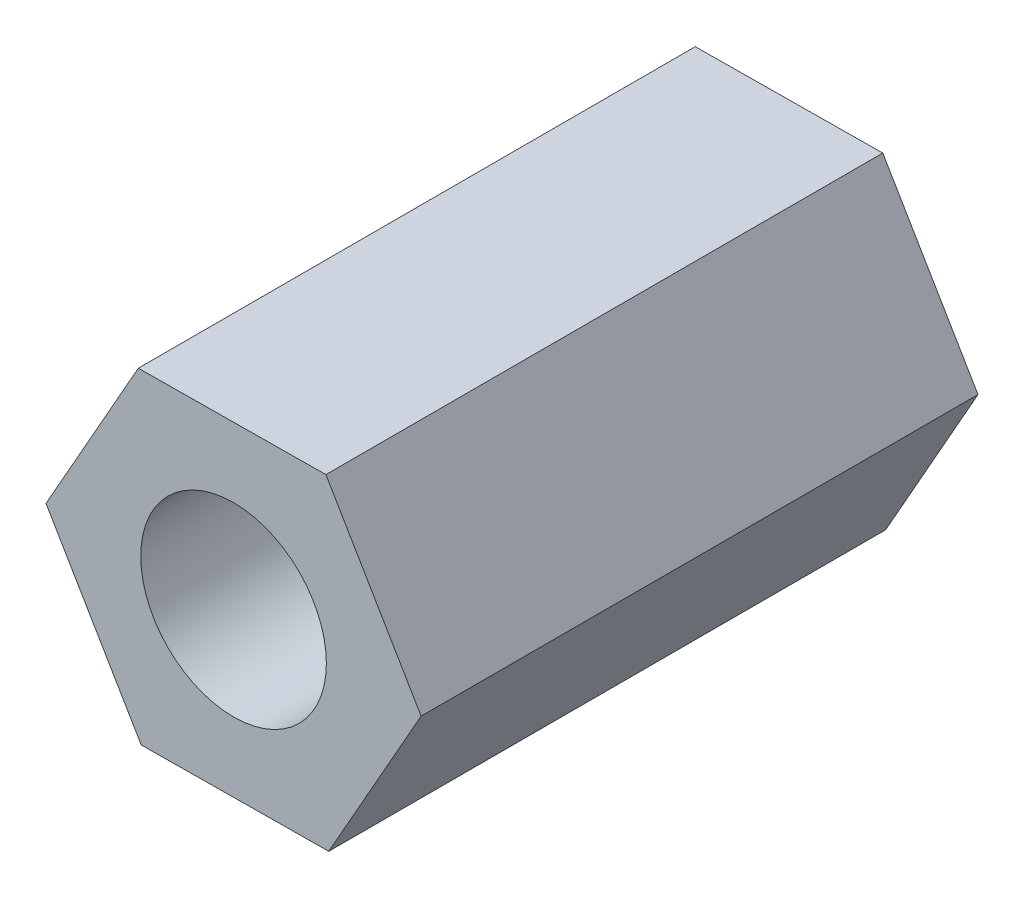
ISO-10303-21;
HEADER;
FILE_DESCRIPTION(('STEP AP214'),'2;1');
FILE_NAME('part.step','',(''),(''),'','','');
FILE_SCHEMA(('AUTOMOTIVE_DESIGN { 1 0 10303 214 1 1 1 1 }'));
ENDSEC;
DATA;
#1=APPLICATION_CONTEXT('core data for automotive mechanical design processes');
#2=APPLICATION_PROTOCOL_DEFINITION('international standard','automotive_design',2000,#1);
#3=PRODUCT_CONTEXT('',#1,'mechanical');
#4=PRODUCT('Part','Part','',(#3));
#5=PRODUCT_RELATED_PRODUCT_CATEGORY('part','',(#4));
#6=PRODUCT_DEFINITION_FORMATION('','',#4);
#7=PRODUCT_DEFINITION_CONTEXT('part definition',#1,'design');
#8=PRODUCT_DEFINITION('design','',#6,#7);
#9=PRODUCT_DEFINITION_SHAPE('','',#8);
#10=(LENGTH_UNIT() NAMED_UNIT(*) SI_UNIT(.MILLI.,.METRE.));
#11=(NAMED_UNIT(*) PLANE_ANGLE_UNIT() SI_UNIT($,.RADIAN.));
#12=(NAMED_UNIT(*) SI_UNIT($,.STERADIAN.) SOLID_ANGLE_UNIT());
#13=UNCERTAINTY_MEASURE_WITH_UNIT(LENGTH_MEASURE(1.E-05),#10,'distance_accuracy_value','');
#14=(GEOMETRIC_REPRESENTATION_CONTEXT(3) GLOBAL_UNCERTAINTY_ASSIGNED_CONTEXT((#13)) GLOBAL_UNIT_ASSIGNED_CONTEXT((#10,
#11,#12)) REPRESENTATION_CONTEXT('',''));
#15=CARTESIAN_POINT('',(0.,0.,0.));
#16=DIRECTION('',(0.,0.,1.));
#17=DIRECTION('',(1.,0.,0.));
#18=AXIS2_PLACEMENT_3D('',#15,#16,#17);
#19=CARTESIAN_POINT('',(0.,0.,12.));
#20=DIRECTION('',(0.,0.,1.));
#21=DIRECTION('',(1.,0.,0.));
#22=AXIS2_PLACEMENT_3D('',#19,#20,#21);
#23=PLANE('',#22);
#24=DIRECTION('',(0.999961257640527,0.00880245522430722,0.));
#25=VECTOR('',#24,1.);
#26=CARTESIAN_POINT('',(-1.98983906118775,-3.51765175136834,12.));
#27=LINE('',#26,#25);
#28=CARTESIAN_POINT('',(-1.98983906118775,-3.51765175136834,12.));
#29=VERTEX_POINT('',#28);
#30=CARTESIAN_POINT('',(2.05145624775792,-3.48207705211536,12.));
#31=VERTEX_POINT('',#30);
#32=EDGE_CURVE('E133',#29,#31,#27,.T.);
#33=ORIENTED_EDGE('',*,*,#32,.T.);
#34=DIRECTION('',(0.492357478980338,0.870393079529086,0.));
#35=VECTOR('',#34,1.);
#36=CARTESIAN_POINT('',(2.05145624775792,-3.48207705211536,12.));
#37=LINE('',#36,#35);
#38=CARTESIAN_POINT('',(4.04129530894568,0.0355746992529791,12.));
#39=VERTEX_POINT('',#38);
#40=EDGE_CURVE('E91',#31,#39,#37,.T.);
#41=ORIENTED_EDGE('',*,*,#40,.T.);
#42=DIRECTION('',(-0.507603778660189,0.861590624304779,0.));
#43=VECTOR('',#42,1.);
#44=CARTESIAN_POINT('',(4.04129530894568,0.0355746992529791,12.));
#45=LINE('',#44,#43);
#46=CARTESIAN_POINT('',(1.98983906118776,3.51765175136834,12.));
#47=VERTEX_POINT('',#46);
#48=EDGE_CURVE('E104',#39,#47,#45,.T.);
#49=ORIENTED_EDGE('',*,*,#48,.T.);
#50=DIRECTION('',(-0.999961257640527,-0.00880245522430723,0.));
#51=VECTOR('',#50,1.);
#52=CARTESIAN_POINT('',(1.98983906118776,3.51765175136834,12.));
#53=LINE('',#52,#51);
#54=CARTESIAN_POINT('',(-2.05145624775791,3.48207705211536,12.));
#55=VERTEX_POINT('',#54);
#56=EDGE_CURVE('E98',#47,#55,#53,.T.);
#57=ORIENTED_EDGE('',*,*,#56,.T.);
#58=DIRECTION('',(-0.492357478980338,-0.870393079529086,0.));
#59=VECTOR('',#58,1.);
#60=CARTESIAN_POINT('',(-2.05145624775791,3.48207705211536,12.));
#61=LINE('',#60,#59);
#62=CARTESIAN_POINT('',(-4.04129530894568,-0.0355746992529825,12.));
#63=VERTEX_POINT('',#62);
#64=EDGE_CURVE('E102',#55,#63,#61,.T.);
#65=ORIENTED_EDGE('',*,*,#64,.T.);
#66=DIRECTION('',(0.507603778660189,-0.861590624304779,0.));
#67=VECTOR('',#66,1.);
#68=CARTESIAN_POINT('',(-4.04129530894568,-0.0355746992529825,12.));
#69=LINE('',#68,#67);
#70=EDGE_CURVE('E54',#63,#29,#69,.T.);
#71=ORIENTED_EDGE('',*,*,#70,.T.);
#72=EDGE_LOOP('',(#33,#41,#49,#57,#65,#71));
#73=FACE_BOUND('',#72,.T.);
#74=CARTESIAN_POINT('',(0.,0.,12.));
#75=DIRECTION('',(0.,0.,1.));
#76=DIRECTION('',(1.,0.,0.));
#77=AXIS2_PLACEMENT_3D('',#74,#75,#76);
#78=CIRCLE('',#77,2.);
#79=CARTESIAN_POINT('',(2.,0.,12.));
#80=VERTEX_POINT('',#79);
#81=EDGE_CURVE('E126',#80,#80,#78,.T.);
#82=ORIENTED_EDGE('',*,*,#81,.F.);
#83=EDGE_LOOP('',(#82));
#84=FACE_BOUND('',#83,.T.);
#85=ADVANCED_FACE('F37',(#73,#84),#23,.T.);
#86=CARTESIAN_POINT('',(0.,0.,0.));
#87=DIRECTION('',(0.,0.,1.));
#88=DIRECTION('',(1.,0.,0.));
#89=AXIS2_PLACEMENT_3D('',#86,#87,#88);
#90=PLANE('',#89);
#91=DIRECTION('',(0.999961257640527,0.00880245522430722,0.));
#92=VECTOR('',#91,1.);
#93=CARTESIAN_POINT('',(-1.98983906118775,-3.51765175136834,0.));
#94=LINE('',#93,#92);
#95=CARTESIAN_POINT('',(-1.98983906118775,-3.51765175136834,0.));
#96=VERTEX_POINT('',#95);
#97=CARTESIAN_POINT('',(2.05145624775792,-3.48207705211536,0.));
#98=VERTEX_POINT('',#97);
#99=EDGE_CURVE('E122',#96,#98,#94,.T.);
#100=ORIENTED_EDGE('',*,*,#99,.F.);
#101=DIRECTION('',(0.507603778660189,-0.861590624304779,0.));
#102=VECTOR('',#101,1.);
#103=CARTESIAN_POINT('',(-4.04129530894568,-0.0355746992529825,0.));
#104=LINE('',#103,#102);
#105=CARTESIAN_POINT('',(-4.04129530894568,-0.0355746992529825,0.));
#106=VERTEX_POINT('',#105);
#107=EDGE_CURVE('E83',#106,#96,#104,.T.);
#108=ORIENTED_EDGE('',*,*,#107,.F.);
#109=DIRECTION('',(-0.492357478980338,-0.870393079529086,0.));
#110=VECTOR('',#109,1.);
#111=CARTESIAN_POINT('',(-2.05145624775791,3.48207705211536,0.));
#112=LINE('',#111,#110);
#113=CARTESIAN_POINT('',(-2.05145624775791,3.48207705211536,0.));
#114=VERTEX_POINT('',#113);
#115=EDGE_CURVE('E77',#114,#106,#112,.T.);
#116=ORIENTED_EDGE('',*,*,#115,.F.);
#117=DIRECTION('',(-0.999961257640527,-0.00880245522430723,0.));
#118=VECTOR('',#117,1.);
#119=CARTESIAN_POINT('',(1.98983906118776,3.51765175136834,0.));
#120=LINE('',#119,#118);
#121=CARTESIAN_POINT('',(1.98983906118776,3.51765175136834,0.));
#122=VERTEX_POINT('',#121);
#123=EDGE_CURVE('E112',#122,#114,#120,.T.);
#124=ORIENTED_EDGE('',*,*,#123,.F.);
#125=DIRECTION('',(-0.507603778660189,0.861590624304779,0.));
#126=VECTOR('',#125,1.);
#127=CARTESIAN_POINT('',(4.04129530894568,0.0355746992529791,0.));
#128=LINE('',#127,#126);
#129=CARTESIAN_POINT('',(4.04129530894568,0.0355746992529791,0.));
#130=VERTEX_POINT('',#129);
#131=EDGE_CURVE('E128',#130,#122,#128,.T.);
#132=ORIENTED_EDGE('',*,*,#131,.F.);
#133=DIRECTION('',(0.492357478980338,0.870393079529086,0.));
#134=VECTOR('',#133,1.);
#135=CARTESIAN_POINT('',(2.05145624775792,-3.48207705211536,0.));
#136=LINE('',#135,#134);
#137=EDGE_CURVE('E125',#98,#130,#136,.T.);
#138=ORIENTED_EDGE('',*,*,#137,.F.);
#139=EDGE_LOOP('',(#100,#108,#116,#124,#132,#138));
#140=FACE_BOUND('',#139,.T.);
#141=CARTESIAN_POINT('',(0.,0.,0.));
#142=DIRECTION('',(0.,0.,1.));
#143=DIRECTION('',(1.,0.,0.));
#144=AXIS2_PLACEMENT_3D('',#141,#142,#143);
#145=CIRCLE('',#144,2.);
#146=CARTESIAN_POINT('',(2.,0.,0.));
#147=VERTEX_POINT('',#146);
#148=EDGE_CURVE('E226',#147,#147,#145,.T.);
#149=ORIENTED_EDGE('',*,*,#148,.T.);
#150=EDGE_LOOP('',(#149));
#151=FACE_BOUND('',#150,.T.);
#152=ADVANCED_FACE('F142',(#140,#151),#90,.F.);
#153=CARTESIAN_POINT('',(-1.98983906118775,-3.51765175136834,12.));
#154=DIRECTION('',(-0.00880245522430722,0.999961257640527,0.));
#155=DIRECTION('',(-0.999961257640527,-0.00880245522430722,0.));
#156=AXIS2_PLACEMENT_3D('',#153,#154,#155);
#157=PLANE('',#156);
#158=ORIENTED_EDGE('',*,*,#99,.T.);
#159=DIRECTION('',(0.,0.,-1.));
#160=VECTOR('',#159,1.);
#161=CARTESIAN_POINT('',(2.05145624775792,-3.48207705211536,12.));
#162=LINE('',#161,#160);
#163=EDGE_CURVE('E11',#31,#98,#162,.T.);
#164=ORIENTED_EDGE('',*,*,#163,.F.);
#165=ORIENTED_EDGE('',*,*,#32,.F.);
#166=DIRECTION('',(0.,0.,-1.));
#167=VECTOR('',#166,1.);
#168=CARTESIAN_POINT('',(-1.98983906118775,-3.51765175136834,12.));
#169=LINE('',#168,#167);
#170=EDGE_CURVE('E118',#29,#96,#169,.T.);
#171=ORIENTED_EDGE('',*,*,#170,.T.);
#172=EDGE_LOOP('',(#158,#164,#165,#171));
#173=FACE_BOUND('',#172,.T.);
#174=ADVANCED_FACE('F39',(#173),#157,.F.);
#175=CARTESIAN_POINT('',(2.05145624775792,-3.48207705211536,12.));
#176=DIRECTION('',(-0.870393079529086,0.492357478980338,0.));
#177=DIRECTION('',(-0.492357478980338,-0.870393079529086,0.));
#178=AXIS2_PLACEMENT_3D('',#175,#176,#177);
#179=PLANE('',#178);
#180=ORIENTED_EDGE('',*,*,#137,.T.);
#181=DIRECTION('',(0.,0.,-1.));
#182=VECTOR('',#181,1.);
#183=CARTESIAN_POINT('',(4.04129530894568,0.0355746992529791,12.));
#184=LINE('',#183,#182);
#185=EDGE_CURVE('E46',#39,#130,#184,.T.);
#186=ORIENTED_EDGE('',*,*,#185,.F.);
#187=ORIENTED_EDGE('',*,*,#40,.F.);
#188=ORIENTED_EDGE('',*,*,#163,.T.);
#189=EDGE_LOOP('',(#180,#186,#187,#188));
#190=FACE_BOUND('',#189,.T.);
#191=ADVANCED_FACE('F167',(#190),#179,.F.);
#192=CARTESIAN_POINT('',(4.04129530894568,0.0355746992529791,12.));
#193=DIRECTION('',(-0.861590624304778,-0.507603778660189,0.));
#194=DIRECTION('',(0.507603778660189,-0.861590624304779,0.));
#195=AXIS2_PLACEMENT_3D('',#192,#193,#194);
#196=PLANE('',#195);
#197=ORIENTED_EDGE('',*,*,#131,.T.);
#198=DIRECTION('',(0.,0.,-1.));
#199=VECTOR('',#198,1.);
#200=CARTESIAN_POINT('',(1.98983906118776,3.51765175136834,12.));
#201=LINE('',#200,#199);
#202=EDGE_CURVE('E113',#47,#122,#201,.T.);
#203=ORIENTED_EDGE('',*,*,#202,.F.);
#204=ORIENTED_EDGE('',*,*,#48,.F.);
#205=ORIENTED_EDGE('',*,*,#185,.T.);
#206=EDGE_LOOP('',(#197,#203,#204,#205));
#207=FACE_BOUND('',#206,.T.);
#208=ADVANCED_FACE('F139',(#207),#196,.F.);
#209=CARTESIAN_POINT('',(1.98983906118776,3.51765175136834,12.));
#210=DIRECTION('',(0.00880245522430723,-0.999961257640527,0.));
#211=DIRECTION('',(0.999961257640527,0.00880245522430723,0.));
#212=AXIS2_PLACEMENT_3D('',#209,#210,#211);
#213=PLANE('',#212);
#214=ORIENTED_EDGE('',*,*,#123,.T.);
#215=DIRECTION('',(0.,0.,-1.));
#216=VECTOR('',#215,1.);
#217=CARTESIAN_POINT('',(-2.05145624775791,3.48207705211536,12.));
#218=LINE('',#217,#216);
#219=EDGE_CURVE('E109',#55,#114,#218,.T.);
#220=ORIENTED_EDGE('',*,*,#219,.F.);
#221=ORIENTED_EDGE('',*,*,#56,.F.);
#222=ORIENTED_EDGE('',*,*,#202,.T.);
#223=EDGE_LOOP('',(#214,#220,#221,#222));
#224=FACE_BOUND('',#223,.T.);
#225=ADVANCED_FACE('F110',(#224),#213,.F.);
#226=CARTESIAN_POINT('',(-2.05145624775791,3.48207705211536,12.));
#227=DIRECTION('',(0.870393079529086,-0.492357478980338,0.));
#228=DIRECTION('',(0.492357478980338,0.870393079529086,0.));
#229=AXIS2_PLACEMENT_3D('',#226,#227,#228);
#230=PLANE('',#229);
#231=ORIENTED_EDGE('',*,*,#115,.T.);
#232=DIRECTION('',(0.,0.,-1.));
#233=VECTOR('',#232,1.);
#234=CARTESIAN_POINT('',(-4.04129530894568,-0.0355746992529825,12.));
#235=LINE('',#234,#233);
#236=EDGE_CURVE('E114',#63,#106,#235,.T.);
#237=ORIENTED_EDGE('',*,*,#236,.F.);
#238=ORIENTED_EDGE('',*,*,#64,.F.);
#239=ORIENTED_EDGE('',*,*,#219,.T.);
#240=EDGE_LOOP('',(#231,#237,#238,#239));
#241=FACE_BOUND('',#240,.T.);
#242=ADVANCED_FACE('F116',(#241),#230,.F.);
#243=CARTESIAN_POINT('',(-4.04129530894568,-0.0355746992529825,12.));
#244=DIRECTION('',(0.861590624304779,0.507603778660189,0.));
#245=DIRECTION('',(-0.507603778660189,0.861590624304779,0.));
#246=AXIS2_PLACEMENT_3D('',#243,#244,#245);
#247=PLANE('',#246);
#248=ORIENTED_EDGE('',*,*,#107,.T.);
#249=ORIENTED_EDGE('',*,*,#170,.F.);
#250=ORIENTED_EDGE('',*,*,#70,.F.);
#251=ORIENTED_EDGE('',*,*,#236,.T.);
#252=EDGE_LOOP('',(#248,#249,#250,#251));
#253=FACE_BOUND('',#252,.T.);
#254=ADVANCED_FACE('F147',(#253),#247,.F.);
#255=CARTESIAN_POINT('',(0.,0.,12.));
#256=DIRECTION('',(0.,0.,-1.));
#257=DIRECTION('',(-1.,0.,0.));
#258=AXIS2_PLACEMENT_3D('',#255,#256,#257);
#259=CYLINDRICAL_SURFACE('',#258,2.);
#260=ORIENTED_EDGE('',*,*,#81,.T.);
#261=EDGE_LOOP('',(#260));
#262=FACE_BOUND('',#261,.T.);
#263=ORIENTED_EDGE('',*,*,#148,.F.);
#264=EDGE_LOOP('',(#263));
#265=FACE_BOUND('',#264,.T.);
#266=ADVANCED_FACE('F149',(#262,#265),#259,.F.);
#267=CLOSED_SHELL('',(#85,#152,#174,#191,#208,#225,#242,#254,#266));
#268=MANIFOLD_SOLID_BREP('B2',#267);
#269=ADVANCED_BREP_SHAPE_REPRESENTATION('',(#18,#268),#14);
#270=SHAPE_DEFINITION_REPRESENTATION(#9,#269);
ENDSEC;
END-ISO-10303-21;
